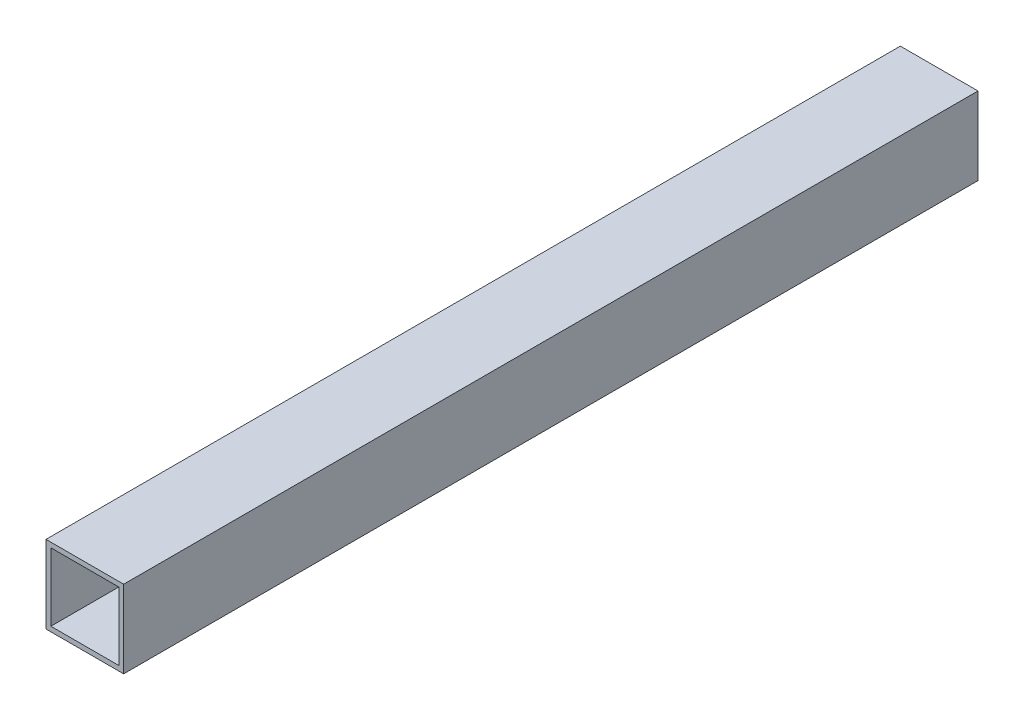
ISO-10303-21;
HEADER;
FILE_DESCRIPTION(('STEP AP214'),'2;1');
FILE_NAME('part.step','',(''),(''),'','','');
FILE_SCHEMA(('AUTOMOTIVE_DESIGN { 1 0 10303 214 1 1 1 1 }'));
ENDSEC;
DATA;
#1=APPLICATION_CONTEXT('core data for automotive mechanical design processes');
#2=APPLICATION_PROTOCOL_DEFINITION('international standard','automotive_design',2000,#1);
#3=PRODUCT_CONTEXT('',#1,'mechanical');
#4=PRODUCT('Part','Part','',(#3));
#5=PRODUCT_RELATED_PRODUCT_CATEGORY('part','',(#4));
#6=PRODUCT_DEFINITION_FORMATION('','',#4);
#7=PRODUCT_DEFINITION_CONTEXT('part definition',#1,'design');
#8=PRODUCT_DEFINITION('design','',#6,#7);
#9=PRODUCT_DEFINITION_SHAPE('','',#8);
#10=(LENGTH_UNIT() NAMED_UNIT(*) SI_UNIT(.MILLI.,.METRE.));
#11=(NAMED_UNIT(*) PLANE_ANGLE_UNIT() SI_UNIT($,.RADIAN.));
#12=(NAMED_UNIT(*) SI_UNIT($,.STERADIAN.) SOLID_ANGLE_UNIT());
#13=UNCERTAINTY_MEASURE_WITH_UNIT(LENGTH_MEASURE(1.E-05),#10,'distance_accuracy_value','');
#14=(GEOMETRIC_REPRESENTATION_CONTEXT(3) GLOBAL_UNCERTAINTY_ASSIGNED_CONTEXT((#13)) GLOBAL_UNIT_ASSIGNED_CONTEXT((#10,
#11,#12)) REPRESENTATION_CONTEXT('',''));
#15=CARTESIAN_POINT('',(0.,0.,0.));
#16=DIRECTION('',(0.,0.,1.));
#17=DIRECTION('',(1.,0.,0.));
#18=AXIS2_PLACEMENT_3D('',#15,#16,#17);
#19=CARTESIAN_POINT('',(0.,0.,139.7));
#20=DIRECTION('',(0.,0.,1.));
#21=DIRECTION('',(1.,0.,0.));
#22=AXIS2_PLACEMENT_3D('',#19,#20,#21);
#23=PLANE('',#22);
#24=DIRECTION('',(0.,1.,0.));
#25=VECTOR('',#24,1.);
#26=CARTESIAN_POINT('',(12.7,12.7,139.7));
#27=LINE('',#26,#25);
#28=CARTESIAN_POINT('',(12.7,-12.7,139.7));
#29=VERTEX_POINT('',#28);
#30=CARTESIAN_POINT('',(12.7,12.7,139.7));
#31=VERTEX_POINT('',#30);
#32=EDGE_CURVE('E134',#29,#31,#27,.T.);
#33=ORIENTED_EDGE('',*,*,#32,.T.);
#34=DIRECTION('',(-1.,0.,0.));
#35=VECTOR('',#34,1.);
#36=CARTESIAN_POINT('',(-12.7,12.7,139.7));
#37=LINE('',#36,#35);
#38=CARTESIAN_POINT('',(-12.7,12.7,139.7));
#39=VERTEX_POINT('',#38);
#40=EDGE_CURVE('E137',#31,#39,#37,.T.);
#41=ORIENTED_EDGE('',*,*,#40,.T.);
#42=DIRECTION('',(0.,-1.,0.));
#43=VECTOR('',#42,1.);
#44=CARTESIAN_POINT('',(-12.7,12.7,139.7));
#45=LINE('',#44,#43);
#46=CARTESIAN_POINT('',(-12.7,-12.7,139.7));
#47=VERTEX_POINT('',#46);
#48=EDGE_CURVE('E140',#39,#47,#45,.T.);
#49=ORIENTED_EDGE('',*,*,#48,.T.);
#50=DIRECTION('',(1.,0.,0.));
#51=VECTOR('',#50,1.);
#52=CARTESIAN_POINT('',(-12.7,-12.7,139.7));
#53=LINE('',#52,#51);
#54=EDGE_CURVE('E142',#47,#29,#53,.T.);
#55=ORIENTED_EDGE('',*,*,#54,.T.);
#56=EDGE_LOOP('',(#33,#41,#49,#55));
#57=FACE_BOUND('',#56,.T.);
#58=DIRECTION('',(-1.,0.,0.));
#59=VECTOR('',#58,1.);
#60=CARTESIAN_POINT('',(-11.1125,11.1125,139.7));
#61=LINE('',#60,#59);
#62=CARTESIAN_POINT('',(11.1125,11.1125,139.7));
#63=VERTEX_POINT('',#62);
#64=CARTESIAN_POINT('',(-11.1125,11.1125,139.7));
#65=VERTEX_POINT('',#64);
#66=EDGE_CURVE('E106',#63,#65,#61,.T.);
#67=ORIENTED_EDGE('',*,*,#66,.F.);
#68=DIRECTION('',(0.,1.,0.));
#69=VECTOR('',#68,1.);
#70=CARTESIAN_POINT('',(11.1125,11.1125,139.7));
#71=LINE('',#70,#69);
#72=CARTESIAN_POINT('',(11.1125,-11.1125,139.7));
#73=VERTEX_POINT('',#72);
#74=EDGE_CURVE('E98',#73,#63,#71,.T.);
#75=ORIENTED_EDGE('',*,*,#74,.F.);
#76=DIRECTION('',(1.,0.,0.));
#77=VECTOR('',#76,1.);
#78=CARTESIAN_POINT('',(-11.1125,-11.1125,139.7));
#79=LINE('',#78,#77);
#80=CARTESIAN_POINT('',(-11.1125,-11.1125,139.7));
#81=VERTEX_POINT('',#80);
#82=EDGE_CURVE('E120',#81,#73,#79,.T.);
#83=ORIENTED_EDGE('',*,*,#82,.F.);
#84=DIRECTION('',(0.,-1.,0.));
#85=VECTOR('',#84,1.);
#86=CARTESIAN_POINT('',(-11.1125,11.1125,139.7));
#87=LINE('',#86,#85);
#88=EDGE_CURVE('E118',#65,#81,#87,.T.);
#89=ORIENTED_EDGE('',*,*,#88,.F.);
#90=EDGE_LOOP('',(#67,#75,#83,#89));
#91=FACE_BOUND('',#90,.T.);
#92=ADVANCED_FACE('F33',(#57,#91),#23,.T.);
#93=CARTESIAN_POINT('',(0.,0.,-139.7));
#94=DIRECTION('',(0.,0.,1.));
#95=DIRECTION('',(1.,0.,0.));
#96=AXIS2_PLACEMENT_3D('',#93,#94,#95);
#97=PLANE('',#96);
#98=DIRECTION('',(0.,1.,0.));
#99=VECTOR('',#98,1.);
#100=CARTESIAN_POINT('',(12.7,12.7,-139.7));
#101=LINE('',#100,#99);
#102=CARTESIAN_POINT('',(12.7,-12.7,-139.7));
#103=VERTEX_POINT('',#102);
#104=CARTESIAN_POINT('',(12.7,12.7,-139.7));
#105=VERTEX_POINT('',#104);
#106=EDGE_CURVE('E114',#103,#105,#101,.T.);
#107=ORIENTED_EDGE('',*,*,#106,.F.);
#108=DIRECTION('',(1.,0.,0.));
#109=VECTOR('',#108,1.);
#110=CARTESIAN_POINT('',(-12.7,-12.7,-139.7));
#111=LINE('',#110,#109);
#112=CARTESIAN_POINT('',(-12.7,-12.7,-139.7));
#113=VERTEX_POINT('',#112);
#114=EDGE_CURVE('E138',#113,#103,#111,.T.);
#115=ORIENTED_EDGE('',*,*,#114,.F.);
#116=DIRECTION('',(0.,-1.,0.));
#117=VECTOR('',#116,1.);
#118=CARTESIAN_POINT('',(-12.7,12.7,-139.7));
#119=LINE('',#118,#117);
#120=CARTESIAN_POINT('',(-12.7,12.7,-139.7));
#121=VERTEX_POINT('',#120);
#122=EDGE_CURVE('E149',#121,#113,#119,.T.);
#123=ORIENTED_EDGE('',*,*,#122,.F.);
#124=DIRECTION('',(-1.,0.,0.));
#125=VECTOR('',#124,1.);
#126=CARTESIAN_POINT('',(-12.7,12.7,-139.7));
#127=LINE('',#126,#125);
#128=EDGE_CURVE('E147',#105,#121,#127,.T.);
#129=ORIENTED_EDGE('',*,*,#128,.F.);
#130=EDGE_LOOP('',(#107,#115,#123,#129));
#131=FACE_BOUND('',#130,.T.);
#132=DIRECTION('',(0.,1.,0.));
#133=VECTOR('',#132,1.);
#134=CARTESIAN_POINT('',(11.1125,11.1125,-139.7));
#135=LINE('',#134,#133);
#136=CARTESIAN_POINT('',(11.1125,-11.1125,-139.7));
#137=VERTEX_POINT('',#136);
#138=CARTESIAN_POINT('',(11.1125,11.1125,-139.7));
#139=VERTEX_POINT('',#138);
#140=EDGE_CURVE('E56',#137,#139,#135,.T.);
#141=ORIENTED_EDGE('',*,*,#140,.T.);
#142=DIRECTION('',(-1.,0.,0.));
#143=VECTOR('',#142,1.);
#144=CARTESIAN_POINT('',(-11.1125,11.1125,-139.7));
#145=LINE('',#144,#143);
#146=CARTESIAN_POINT('',(-11.1125,11.1125,-139.7));
#147=VERTEX_POINT('',#146);
#148=EDGE_CURVE('E113',#139,#147,#145,.T.);
#149=ORIENTED_EDGE('',*,*,#148,.T.);
#150=DIRECTION('',(0.,-1.,0.));
#151=VECTOR('',#150,1.);
#152=CARTESIAN_POINT('',(-11.1125,11.1125,-139.7));
#153=LINE('',#152,#151);
#154=CARTESIAN_POINT('',(-11.1125,-11.1125,-139.7));
#155=VERTEX_POINT('',#154);
#156=EDGE_CURVE('E126',#147,#155,#153,.T.);
#157=ORIENTED_EDGE('',*,*,#156,.T.);
#158=DIRECTION('',(1.,0.,0.));
#159=VECTOR('',#158,1.);
#160=CARTESIAN_POINT('',(-11.1125,-11.1125,-139.7));
#161=LINE('',#160,#159);
#162=EDGE_CURVE('E107',#155,#137,#161,.T.);
#163=ORIENTED_EDGE('',*,*,#162,.T.);
#164=EDGE_LOOP('',(#141,#149,#157,#163));
#165=FACE_BOUND('',#164,.T.);
#166=ADVANCED_FACE('F167',(#131,#165),#97,.F.);
#167=CARTESIAN_POINT('',(12.7,12.7,139.7));
#168=DIRECTION('',(-1.,0.,0.));
#169=DIRECTION('',(0.,-1.,0.));
#170=AXIS2_PLACEMENT_3D('',#167,#168,#169);
#171=PLANE('',#170);
#172=ORIENTED_EDGE('',*,*,#106,.T.);
#173=DIRECTION('',(0.,0.,-1.));
#174=VECTOR('',#173,1.);
#175=CARTESIAN_POINT('',(12.7,12.7,139.7));
#176=LINE('',#175,#174);
#177=EDGE_CURVE('E11',#31,#105,#176,.T.);
#178=ORIENTED_EDGE('',*,*,#177,.F.);
#179=ORIENTED_EDGE('',*,*,#32,.F.);
#180=DIRECTION('',(0.,0.,-1.));
#181=VECTOR('',#180,1.);
#182=CARTESIAN_POINT('',(12.7,-12.7,139.7));
#183=LINE('',#182,#181);
#184=EDGE_CURVE('E144',#29,#103,#183,.T.);
#185=ORIENTED_EDGE('',*,*,#184,.T.);
#186=EDGE_LOOP('',(#172,#178,#179,#185));
#187=FACE_BOUND('',#186,.T.);
#188=ADVANCED_FACE('F35',(#187),#171,.F.);
#189=CARTESIAN_POINT('',(-12.7,12.7,139.7));
#190=DIRECTION('',(0.,-1.,0.));
#191=DIRECTION('',(0.,0.,-1.));
#192=AXIS2_PLACEMENT_3D('',#189,#190,#191);
#193=PLANE('',#192);
#194=ORIENTED_EDGE('',*,*,#128,.T.);
#195=DIRECTION('',(0.,0.,-1.));
#196=VECTOR('',#195,1.);
#197=CARTESIAN_POINT('',(-12.7,12.7,139.7));
#198=LINE('',#197,#196);
#199=EDGE_CURVE('E41',#39,#121,#198,.T.);
#200=ORIENTED_EDGE('',*,*,#199,.F.);
#201=ORIENTED_EDGE('',*,*,#40,.F.);
#202=ORIENTED_EDGE('',*,*,#177,.T.);
#203=EDGE_LOOP('',(#194,#200,#201,#202));
#204=FACE_BOUND('',#203,.T.);
#205=ADVANCED_FACE('F177',(#204),#193,.F.);
#206=CARTESIAN_POINT('',(-12.7,12.7,139.7));
#207=DIRECTION('',(1.,0.,0.));
#208=DIRECTION('',(0.,1.,0.));
#209=AXIS2_PLACEMENT_3D('',#206,#207,#208);
#210=PLANE('',#209);
#211=ORIENTED_EDGE('',*,*,#122,.T.);
#212=DIRECTION('',(0.,0.,-1.));
#213=VECTOR('',#212,1.);
#214=CARTESIAN_POINT('',(-12.7,-12.7,139.7));
#215=LINE('',#214,#213);
#216=EDGE_CURVE('E154',#47,#113,#215,.T.);
#217=ORIENTED_EDGE('',*,*,#216,.F.);
#218=ORIENTED_EDGE('',*,*,#48,.F.);
#219=ORIENTED_EDGE('',*,*,#199,.T.);
#220=EDGE_LOOP('',(#211,#217,#218,#219));
#221=FACE_BOUND('',#220,.T.);
#222=ADVANCED_FACE('F161',(#221),#210,.F.);
#223=CARTESIAN_POINT('',(-12.7,-12.7,139.7));
#224=DIRECTION('',(0.,1.,0.));
#225=DIRECTION('',(0.,0.,1.));
#226=AXIS2_PLACEMENT_3D('',#223,#224,#225);
#227=PLANE('',#226);
#228=ORIENTED_EDGE('',*,*,#114,.T.);
#229=ORIENTED_EDGE('',*,*,#184,.F.);
#230=ORIENTED_EDGE('',*,*,#54,.F.);
#231=ORIENTED_EDGE('',*,*,#216,.T.);
#232=EDGE_LOOP('',(#228,#229,#230,#231));
#233=FACE_BOUND('',#232,.T.);
#234=ADVANCED_FACE('F171',(#233),#227,.F.);
#235=CARTESIAN_POINT('',(11.1125,11.1125,139.7));
#236=DIRECTION('',(-1.,0.,0.));
#237=DIRECTION('',(0.,0.,1.));
#238=AXIS2_PLACEMENT_3D('',#235,#236,#237);
#239=PLANE('',#238);
#240=ORIENTED_EDGE('',*,*,#140,.F.);
#241=DIRECTION('',(0.,0.,-1.));
#242=VECTOR('',#241,1.);
#243=CARTESIAN_POINT('',(11.1125,-11.1125,139.7));
#244=LINE('',#243,#242);
#245=EDGE_CURVE('E102',#73,#137,#244,.T.);
#246=ORIENTED_EDGE('',*,*,#245,.F.);
#247=ORIENTED_EDGE('',*,*,#74,.T.);
#248=DIRECTION('',(0.,0.,-1.));
#249=VECTOR('',#248,1.);
#250=CARTESIAN_POINT('',(11.1125,11.1125,139.7));
#251=LINE('',#250,#249);
#252=EDGE_CURVE('E101',#63,#139,#251,.T.);
#253=ORIENTED_EDGE('',*,*,#252,.T.);
#254=EDGE_LOOP('',(#240,#246,#247,#253));
#255=FACE_BOUND('',#254,.T.);
#256=ADVANCED_FACE('F100',(#255),#239,.T.);
#257=CARTESIAN_POINT('',(-11.1125,11.1125,139.7));
#258=DIRECTION('',(0.,-1.,0.));
#259=DIRECTION('',(0.,0.,-1.));
#260=AXIS2_PLACEMENT_3D('',#257,#258,#259);
#261=PLANE('',#260);
#262=ORIENTED_EDGE('',*,*,#148,.F.);
#263=ORIENTED_EDGE('',*,*,#252,.F.);
#264=ORIENTED_EDGE('',*,*,#66,.T.);
#265=DIRECTION('',(0.,0.,-1.));
#266=VECTOR('',#265,1.);
#267=CARTESIAN_POINT('',(-11.1125,11.1125,139.7));
#268=LINE('',#267,#266);
#269=EDGE_CURVE('E115',#65,#147,#268,.T.);
#270=ORIENTED_EDGE('',*,*,#269,.T.);
#271=EDGE_LOOP('',(#262,#263,#264,#270));
#272=FACE_BOUND('',#271,.T.);
#273=ADVANCED_FACE('F110',(#272),#261,.T.);
#274=CARTESIAN_POINT('',(-11.1125,11.1125,139.7));
#275=DIRECTION('',(1.,0.,0.));
#276=DIRECTION('',(0.,0.,-1.));
#277=AXIS2_PLACEMENT_3D('',#274,#275,#276);
#278=PLANE('',#277);
#279=ORIENTED_EDGE('',*,*,#156,.F.);
#280=ORIENTED_EDGE('',*,*,#269,.F.);
#281=ORIENTED_EDGE('',*,*,#88,.T.);
#282=DIRECTION('',(0.,0.,-1.));
#283=VECTOR('',#282,1.);
#284=CARTESIAN_POINT('',(-11.1125,-11.1125,139.7));
#285=LINE('',#284,#283);
#286=EDGE_CURVE('E48',#81,#155,#285,.T.);
#287=ORIENTED_EDGE('',*,*,#286,.T.);
#288=EDGE_LOOP('',(#279,#280,#281,#287));
#289=FACE_BOUND('',#288,.T.);
#290=ADVANCED_FACE('F200',(#289),#278,.T.);
#291=CARTESIAN_POINT('',(-11.1125,-11.1125,139.7));
#292=DIRECTION('',(0.,1.,0.));
#293=DIRECTION('',(0.,0.,1.));
#294=AXIS2_PLACEMENT_3D('',#291,#292,#293);
#295=PLANE('',#294);
#296=ORIENTED_EDGE('',*,*,#162,.F.);
#297=ORIENTED_EDGE('',*,*,#286,.F.);
#298=ORIENTED_EDGE('',*,*,#82,.T.);
#299=ORIENTED_EDGE('',*,*,#245,.T.);
#300=EDGE_LOOP('',(#296,#297,#298,#299));
#301=FACE_BOUND('',#300,.T.);
#302=ADVANCED_FACE('F204',(#301),#295,.T.);
#303=CLOSED_SHELL('',(#92,#166,#188,#205,#222,#234,#256,#273,#290,#302));
#304=MANIFOLD_SOLID_BREP('B2',#303);
#305=ADVANCED_BREP_SHAPE_REPRESENTATION('',(#18,#304),#14);
#306=SHAPE_DEFINITION_REPRESENTATION(#9,#305);
ENDSEC;
END-ISO-10303-21;
